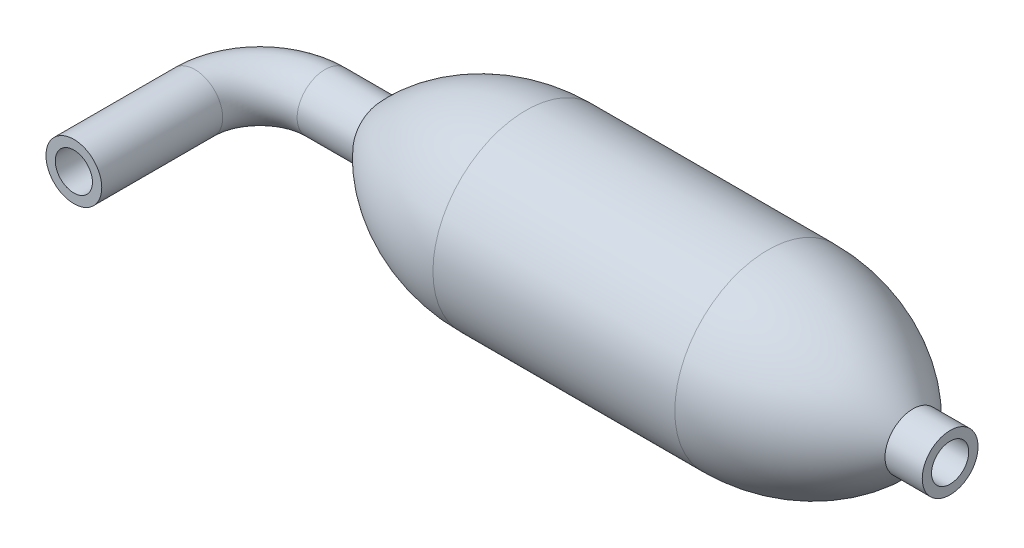
ISO-10303-21;
HEADER;
FILE_DESCRIPTION(('STEP AP214'),'2;1');
FILE_NAME('part.step','',(''),(''),'','','');
FILE_SCHEMA(('AUTOMOTIVE_DESIGN { 1 0 10303 214 1 1 1 1 }'));
ENDSEC;
DATA;
#1=APPLICATION_CONTEXT('core data for automotive mechanical design processes');
#2=APPLICATION_PROTOCOL_DEFINITION('international standard','automotive_design',2000,#1);
#3=PRODUCT_CONTEXT('',#1,'mechanical');
#4=PRODUCT('Part','Part','',(#3));
#5=PRODUCT_RELATED_PRODUCT_CATEGORY('part','',(#4));
#6=PRODUCT_DEFINITION_FORMATION('','',#4);
#7=PRODUCT_DEFINITION_CONTEXT('part definition',#1,'design');
#8=PRODUCT_DEFINITION('design','',#6,#7);
#9=PRODUCT_DEFINITION_SHAPE('','',#8);
#10=(LENGTH_UNIT() NAMED_UNIT(*) SI_UNIT(.MILLI.,.METRE.));
#11=(NAMED_UNIT(*) PLANE_ANGLE_UNIT() SI_UNIT($,.RADIAN.));
#12=(NAMED_UNIT(*) SI_UNIT($,.STERADIAN.) SOLID_ANGLE_UNIT());
#13=UNCERTAINTY_MEASURE_WITH_UNIT(LENGTH_MEASURE(1.E-05),#10,'distance_accuracy_value','');
#14=(GEOMETRIC_REPRESENTATION_CONTEXT(3) GLOBAL_UNCERTAINTY_ASSIGNED_CONTEXT((#13)) GLOBAL_UNIT_ASSIGNED_CONTEXT((#10,
#11,#12)) REPRESENTATION_CONTEXT('',''));
#15=CARTESIAN_POINT('',(0.,0.,0.));
#16=DIRECTION('',(0.,0.,1.));
#17=DIRECTION('',(1.,0.,0.));
#18=AXIS2_PLACEMENT_3D('',#15,#16,#17);
#19=CARTESIAN_POINT('',(-65.,0.,0.));
#20=DIRECTION('',(1.,0.,0.));
#21=DIRECTION('',(0.,0.,-1.));
#22=AXIS2_PLACEMENT_3D('',#19,#20,#21);
#23=CYLINDRICAL_SURFACE('',#22,50.);
#24=CARTESIAN_POINT('',(-65.,0.,0.));
#25=DIRECTION('',(1.,0.,0.));
#26=DIRECTION('',(0.,0.,-1.));
#27=AXIS2_PLACEMENT_3D('',#24,#25,#26);
#28=CIRCLE('',#27,50.);
#29=CARTESIAN_POINT('',(-65.,0.,-50.));
#30=VERTEX_POINT('',#29);
#31=EDGE_CURVE('E48',#30,#30,#28,.T.);
#32=ORIENTED_EDGE('',*,*,#31,.T.);
#33=EDGE_LOOP('',(#32));
#34=FACE_BOUND('',#33,.T.);
#35=CARTESIAN_POINT('',(65.,0.,0.));
#36=DIRECTION('',(1.,0.,0.));
#37=DIRECTION('',(0.,0.,-1.));
#38=AXIS2_PLACEMENT_3D('',#35,#36,#37);
#39=CIRCLE('',#38,50.);
#40=CARTESIAN_POINT('',(65.,0.,-50.));
#41=VERTEX_POINT('',#40);
#42=EDGE_CURVE('E11',#41,#41,#39,.T.);
#43=ORIENTED_EDGE('',*,*,#42,.F.);
#44=EDGE_LOOP('',(#43));
#45=FACE_BOUND('',#44,.T.);
#46=ADVANCED_FACE('F35',(#34,#45),#23,.T.);
#47=CARTESIAN_POINT('',(65.,0.,0.));
#48=DIRECTION('',(-1.,0.,0.));
#49=DIRECTION('',(0.,0.,1.));
#50=AXIS2_PLACEMENT_3D('',#47,#48,#49);
#51=DEGENERATE_TOROIDAL_SURFACE('',#50,54.4142857142857,104.414285714286,.F.);
#52=ORIENTED_EDGE('',*,*,#42,.T.);
#53=EDGE_LOOP('',(#52));
#54=FACE_BOUND('',#53,.T.);
#55=CARTESIAN_POINT('',(143.,0.,0.));
#56=DIRECTION('',(-1.,0.,0.));
#57=DIRECTION('',(0.,0.,1.));
#58=AXIS2_PLACEMENT_3D('',#55,#56,#57);
#59=CIRCLE('',#58,15.);
#60=CARTESIAN_POINT('',(143.,0.,15.));
#61=VERTEX_POINT('',#60);
#62=EDGE_CURVE('E41',#61,#61,#59,.T.);
#63=ORIENTED_EDGE('',*,*,#62,.T.);
#64=EDGE_LOOP('',(#63));
#65=FACE_BOUND('',#64,.T.);
#66=ADVANCED_FACE('F66',(#54,#65),#51,.F.);
#67=CARTESIAN_POINT('',(65.,0.,0.));
#68=DIRECTION('',(-1.,0.,0.));
#69=DIRECTION('',(0.,0.,1.));
#70=AXIS2_PLACEMENT_3D('',#67,#68,#69);
#71=CYLINDRICAL_SURFACE('',#70,15.);
#72=ORIENTED_EDGE('',*,*,#62,.F.);
#73=EDGE_LOOP('',(#72));
#74=FACE_BOUND('',#73,.T.);
#75=CARTESIAN_POINT('',(163.,0.,0.));
#76=DIRECTION('',(-1.,0.,0.));
#77=DIRECTION('',(0.,0.,1.));
#78=AXIS2_PLACEMENT_3D('',#75,#76,#77);
#79=CIRCLE('',#78,15.);
#80=CARTESIAN_POINT('',(163.,0.,15.));
#81=VERTEX_POINT('',#80);
#82=EDGE_CURVE('E61',#81,#81,#79,.T.);
#83=ORIENTED_EDGE('',*,*,#82,.T.);
#84=EDGE_LOOP('',(#83));
#85=FACE_BOUND('',#84,.T.);
#86=ADVANCED_FACE('F68',(#74,#85),#71,.T.);
#87=CARTESIAN_POINT('',(163.,15.,0.));
#88=DIRECTION('',(-1.,0.,0.));
#89=DIRECTION('',(0.,0.,1.));
#90=AXIS2_PLACEMENT_3D('',#87,#88,#89);
#91=PLANE('',#90);
#92=CARTESIAN_POINT('',(163.,0.,0.));
#93=DIRECTION('',(-1.,0.,0.));
#94=DIRECTION('',(0.,0.,1.));
#95=AXIS2_PLACEMENT_3D('',#92,#93,#94);
#96=CIRCLE('',#95,10.);
#97=CARTESIAN_POINT('',(163.,0.,10.));
#98=VERTEX_POINT('',#97);
#99=EDGE_CURVE('E110',#98,#98,#96,.T.);
#100=ORIENTED_EDGE('',*,*,#99,.T.);
#101=EDGE_LOOP('',(#100));
#102=FACE_BOUND('',#101,.T.);
#103=ORIENTED_EDGE('',*,*,#82,.F.);
#104=EDGE_LOOP('',(#103));
#105=FACE_BOUND('',#104,.T.);
#106=ADVANCED_FACE('F71',(#102,#105),#91,.F.);
#107=CARTESIAN_POINT('',(-65.,0.,0.));
#108=DIRECTION('',(1.,0.,0.));
#109=DIRECTION('',(0.,0.,1.));
#110=AXIS2_PLACEMENT_3D('',#107,#108,#109);
#111=DEGENERATE_TOROIDAL_SURFACE('',#110,54.4142857142857,104.414285714286,.F.);
#112=ORIENTED_EDGE('',*,*,#31,.F.);
#113=EDGE_LOOP('',(#112));
#114=FACE_BOUND('',#113,.T.);
#115=CARTESIAN_POINT('',(-143.,0.,0.));
#116=DIRECTION('',(-1.,0.,0.));
#117=DIRECTION('',(0.,0.,1.));
#118=AXIS2_PLACEMENT_3D('',#115,#116,#117);
#119=CIRCLE('',#118,15.);
#120=CARTESIAN_POINT('',(-143.,0.,15.));
#121=VERTEX_POINT('',#120);
#122=EDGE_CURVE('E52',#121,#121,#119,.T.);
#123=ORIENTED_EDGE('',*,*,#122,.F.);
#124=EDGE_LOOP('',(#123));
#125=FACE_BOUND('',#124,.T.);
#126=ADVANCED_FACE('F76',(#114,#125),#111,.F.);
#127=CARTESIAN_POINT('',(-65.,0.,0.));
#128=DIRECTION('',(1.,0.,0.));
#129=DIRECTION('',(0.,0.,1.));
#130=AXIS2_PLACEMENT_3D('',#127,#128,#129);
#131=CYLINDRICAL_SURFACE('',#130,15.);
#132=ORIENTED_EDGE('',*,*,#122,.T.);
#133=EDGE_LOOP('',(#132));
#134=FACE_BOUND('',#133,.T.);
#135=CARTESIAN_POINT('',(-173.,0.,0.));
#136=DIRECTION('',(-1.,0.,0.));
#137=DIRECTION('',(0.,0.,1.));
#138=AXIS2_PLACEMENT_3D('',#135,#136,#137);
#139=CIRCLE('',#138,15.);
#140=CARTESIAN_POINT('',(-173.,0.,-15.));
#141=VERTEX_POINT('',#140);
#142=EDGE_CURVE('E55',#141,#141,#139,.T.);
#143=ORIENTED_EDGE('',*,*,#142,.F.);
#144=EDGE_LOOP('',(#143));
#145=FACE_BOUND('',#144,.T.);
#146=ADVANCED_FACE('F82',(#134,#145),#131,.T.);
#147=CARTESIAN_POINT('',(-208.,0.,100.));
#148=DIRECTION('',(0.,0.,1.));
#149=DIRECTION('',(1.,0.,0.));
#150=AXIS2_PLACEMENT_3D('',#147,#148,#149);
#151=PLANE('',#150);
#152=CARTESIAN_POINT('',(-208.,0.,100.));
#153=DIRECTION('',(0.,0.,1.));
#154=DIRECTION('',(1.,0.,0.));
#155=AXIS2_PLACEMENT_3D('',#152,#153,#154);
#156=CIRCLE('',#155,9.99999999999998);
#157=CARTESIAN_POINT('',(-198.,0.,100.));
#158=VERTEX_POINT('',#157);
#159=EDGE_CURVE('E120',#158,#158,#156,.T.);
#160=ORIENTED_EDGE('',*,*,#159,.F.);
#161=EDGE_LOOP('',(#160));
#162=FACE_BOUND('',#161,.T.);
#163=CARTESIAN_POINT('',(-208.,0.,100.));
#164=DIRECTION('',(0.,0.,1.));
#165=DIRECTION('',(1.,0.,0.));
#166=AXIS2_PLACEMENT_3D('',#163,#164,#165);
#167=CIRCLE('',#166,15.);
#168=CARTESIAN_POINT('',(-193.,0.,100.));
#169=VERTEX_POINT('',#168);
#170=EDGE_CURVE('E45',#169,#169,#167,.T.);
#171=ORIENTED_EDGE('',*,*,#170,.T.);
#172=EDGE_LOOP('',(#171));
#173=FACE_BOUND('',#172,.T.);
#174=ADVANCED_FACE('F46',(#162,#173),#151,.T.);
#175=CARTESIAN_POINT('',(-173.,0.,35.));
#176=DIRECTION('',(0.,1.,0.));
#177=DIRECTION('',(0.,0.,1.));
#178=AXIS2_PLACEMENT_3D('',#175,#176,#177);
#179=TOROIDAL_SURFACE('',#178,35.,15.);
#180=CARTESIAN_POINT('',(-208.,0.,35.));
#181=DIRECTION('',(0.,0.,1.));
#182=DIRECTION('',(1.,0.,0.));
#183=AXIS2_PLACEMENT_3D('',#180,#181,#182);
#184=CIRCLE('',#183,15.);
#185=CARTESIAN_POINT('',(-223.,0.,35.));
#186=VERTEX_POINT('',#185);
#187=EDGE_CURVE('E49',#186,#186,#184,.T.);
#188=CARTESIAN_POINT('',(-173.,0.,35.));
#189=DIRECTION('',(0.,1.,0.));
#190=DIRECTION('',(0.,0.,1.));
#191=AXIS2_PLACEMENT_3D('',#188,#189,#190);
#192=CIRCLE('',#191,50.);
#193=EDGE_CURVE('',#141,#186,#192,.T.);
#194=ORIENTED_EDGE('',*,*,#142,.T.);
#195=ORIENTED_EDGE('',*,*,#187,.F.);
#196=ORIENTED_EDGE('',*,*,#193,.T.);
#197=ORIENTED_EDGE('',*,*,#193,.F.);
#198=EDGE_LOOP('',(#194,#196,#195,#197));
#199=FACE_BOUND('',#198,.T.);
#200=ADVANCED_FACE('F133',(#199),#179,.T.);
#201=CARTESIAN_POINT('',(-208.,0.,35.));
#202=DIRECTION('',(0.,0.,1.));
#203=DIRECTION('',(1.,0.,0.));
#204=AXIS2_PLACEMENT_3D('',#201,#202,#203);
#205=CYLINDRICAL_SURFACE('',#204,15.);
#206=ORIENTED_EDGE('',*,*,#170,.F.);
#207=EDGE_LOOP('',(#206));
#208=FACE_BOUND('',#207,.T.);
#209=ORIENTED_EDGE('',*,*,#187,.T.);
#210=EDGE_LOOP('',(#209));
#211=FACE_BOUND('',#210,.T.);
#212=ADVANCED_FACE('F101',(#208,#211),#205,.T.);
#213=CARTESIAN_POINT('',(-65.,0.,0.));
#214=DIRECTION('',(1.,0.,0.));
#215=DIRECTION('',(0.,0.,-1.));
#216=AXIS2_PLACEMENT_3D('',#213,#214,#215);
#217=CYLINDRICAL_SURFACE('',#216,45.);
#218=CARTESIAN_POINT('',(-65.,0.,0.));
#219=DIRECTION('',(1.,0.,0.));
#220=DIRECTION('',(0.,0.,-1.));
#221=AXIS2_PLACEMENT_3D('',#218,#219,#220);
#222=CIRCLE('',#221,45.);
#223=CARTESIAN_POINT('',(-65.,0.,-45.));
#224=VERTEX_POINT('',#223);
#225=EDGE_CURVE('E116',#224,#224,#222,.T.);
#226=ORIENTED_EDGE('',*,*,#225,.F.);
#227=EDGE_LOOP('',(#226));
#228=FACE_BOUND('',#227,.T.);
#229=CARTESIAN_POINT('',(65.,0.,0.));
#230=DIRECTION('',(-1.,0.,0.));
#231=DIRECTION('',(0.,0.,1.));
#232=AXIS2_PLACEMENT_3D('',#229,#230,#231);
#233=CIRCLE('',#232,45.);
#234=CARTESIAN_POINT('',(65.,0.,45.));
#235=VERTEX_POINT('',#234);
#236=EDGE_CURVE('E105',#235,#235,#233,.F.);
#237=ORIENTED_EDGE('',*,*,#236,.T.);
#238=EDGE_LOOP('',(#237));
#239=FACE_BOUND('',#238,.T.);
#240=ADVANCED_FACE('F135',(#228,#239),#217,.F.);
#241=CARTESIAN_POINT('',(65.,0.,0.));
#242=DIRECTION('',(-1.,0.,0.));
#243=DIRECTION('',(0.,0.,1.));
#244=AXIS2_PLACEMENT_3D('',#241,#242,#243);
#245=DEGENERATE_TOROIDAL_SURFACE('',#244,54.4142857142857,99.4142857142857,.F.);
#246=ORIENTED_EDGE('',*,*,#236,.F.);
#247=EDGE_LOOP('',(#246));
#248=FACE_BOUND('',#247,.T.);
#249=CARTESIAN_POINT('',(140.72318007057,0.,0.));
#250=DIRECTION('',(-1.,0.,0.));
#251=DIRECTION('',(0.,0.,1.));
#252=AXIS2_PLACEMENT_3D('',#249,#250,#251);
#253=CIRCLE('',#252,10.);
#254=CARTESIAN_POINT('',(140.72318007057,0.,10.));
#255=VERTEX_POINT('',#254);
#256=EDGE_CURVE('E107',#255,#255,#253,.T.);
#257=ORIENTED_EDGE('',*,*,#256,.F.);
#258=EDGE_LOOP('',(#257));
#259=FACE_BOUND('',#258,.T.);
#260=ADVANCED_FACE('F143',(#248,#259),#245,.T.);
#261=CARTESIAN_POINT('',(65.,0.,0.));
#262=DIRECTION('',(-1.,0.,0.));
#263=DIRECTION('',(0.,0.,1.));
#264=AXIS2_PLACEMENT_3D('',#261,#262,#263);
#265=CYLINDRICAL_SURFACE('',#264,10.);
#266=ORIENTED_EDGE('',*,*,#256,.T.);
#267=EDGE_LOOP('',(#266));
#268=FACE_BOUND('',#267,.T.);
#269=ORIENTED_EDGE('',*,*,#99,.F.);
#270=EDGE_LOOP('',(#269));
#271=FACE_BOUND('',#270,.T.);
#272=ADVANCED_FACE('F150',(#268,#271),#265,.F.);
#273=CARTESIAN_POINT('',(-65.,0.,0.));
#274=DIRECTION('',(1.,0.,0.));
#275=DIRECTION('',(0.,0.,1.));
#276=AXIS2_PLACEMENT_3D('',#273,#274,#275);
#277=DEGENERATE_TOROIDAL_SURFACE('',#276,54.4142857142857,99.4142857142857,.F.);
#278=ORIENTED_EDGE('',*,*,#225,.T.);
#279=EDGE_LOOP('',(#278));
#280=FACE_BOUND('',#279,.T.);
#281=CARTESIAN_POINT('',(-140.72318007057,0.,0.));
#282=DIRECTION('',(1.,0.,0.));
#283=DIRECTION('',(0.,0.,-1.));
#284=AXIS2_PLACEMENT_3D('',#281,#282,#283);
#285=CIRCLE('',#284,10.);
#286=CARTESIAN_POINT('',(-140.72318007057,0.,-10.));
#287=VERTEX_POINT('',#286);
#288=EDGE_CURVE('E112',#287,#287,#285,.F.);
#289=ORIENTED_EDGE('',*,*,#288,.T.);
#290=EDGE_LOOP('',(#289));
#291=FACE_BOUND('',#290,.T.);
#292=ADVANCED_FACE('F158',(#280,#291),#277,.T.);
#293=CARTESIAN_POINT('',(-65.,0.,0.));
#294=DIRECTION('',(1.,0.,0.));
#295=DIRECTION('',(0.,0.,1.));
#296=AXIS2_PLACEMENT_3D('',#293,#294,#295);
#297=CYLINDRICAL_SURFACE('',#296,10.);
#298=ORIENTED_EDGE('',*,*,#288,.F.);
#299=EDGE_LOOP('',(#298));
#300=FACE_BOUND('',#299,.T.);
#301=CARTESIAN_POINT('',(-173.,0.,0.));
#302=DIRECTION('',(1.,0.,0.));
#303=DIRECTION('',(0.,0.,-1.));
#304=AXIS2_PLACEMENT_3D('',#301,#302,#303);
#305=CIRCLE('',#304,10.);
#306=CARTESIAN_POINT('',(-173.,0.,-9.99999999999999));
#307=VERTEX_POINT('',#306);
#308=EDGE_CURVE('E117',#307,#307,#305,.F.);
#309=ORIENTED_EDGE('',*,*,#308,.T.);
#310=EDGE_LOOP('',(#309));
#311=FACE_BOUND('',#310,.T.);
#312=ADVANCED_FACE('F162',(#300,#311),#297,.F.);
#313=CARTESIAN_POINT('',(-173.,0.,35.));
#314=DIRECTION('',(0.,1.,0.));
#315=DIRECTION('',(0.,0.,1.));
#316=AXIS2_PLACEMENT_3D('',#313,#314,#315);
#317=TOROIDAL_SURFACE('',#316,35.,10.);
#318=CARTESIAN_POINT('',(-208.,0.,35.));
#319=DIRECTION('',(0.,0.,1.));
#320=DIRECTION('',(1.,0.,0.));
#321=AXIS2_PLACEMENT_3D('',#318,#319,#320);
#322=CIRCLE('',#321,10.);
#323=CARTESIAN_POINT('',(-218.,0.,35.));
#324=VERTEX_POINT('',#323);
#325=EDGE_CURVE('E113',#324,#324,#322,.T.);
#326=CARTESIAN_POINT('',(-173.,0.,35.));
#327=DIRECTION('',(0.,1.,0.));
#328=DIRECTION('',(0.,0.,1.));
#329=AXIS2_PLACEMENT_3D('',#326,#327,#328);
#330=CIRCLE('',#329,45.);
#331=EDGE_CURVE('',#307,#324,#330,.T.);
#332=ORIENTED_EDGE('',*,*,#308,.F.);
#333=ORIENTED_EDGE('',*,*,#325,.T.);
#334=ORIENTED_EDGE('',*,*,#331,.T.);
#335=ORIENTED_EDGE('',*,*,#331,.F.);
#336=EDGE_LOOP('',(#332,#334,#333,#335));
#337=FACE_BOUND('',#336,.T.);
#338=ADVANCED_FACE('F166',(#337),#317,.F.);
#339=CARTESIAN_POINT('',(-208.,0.,35.));
#340=DIRECTION('',(0.,0.,1.));
#341=DIRECTION('',(1.,0.,0.));
#342=AXIS2_PLACEMENT_3D('',#339,#340,#341);
#343=CYLINDRICAL_SURFACE('',#342,10.);
#344=ORIENTED_EDGE('',*,*,#325,.F.);
#345=EDGE_LOOP('',(#344));
#346=FACE_BOUND('',#345,.T.);
#347=ORIENTED_EDGE('',*,*,#159,.T.);
#348=EDGE_LOOP('',(#347));
#349=FACE_BOUND('',#348,.T.);
#350=ADVANCED_FACE('F130',(#346,#349),#343,.F.);
#351=CLOSED_SHELL('',(#46,#66,#86,#106,#126,#146,#174,#200,#212,#240,#260,#272,#292,#312,#338,#350));
#352=MANIFOLD_SOLID_BREP('B2',#351);
#353=ADVANCED_BREP_SHAPE_REPRESENTATION('',(#18,#352),#14);
#354=SHAPE_DEFINITION_REPRESENTATION(#9,#353);
ENDSEC;
END-ISO-10303-21;
